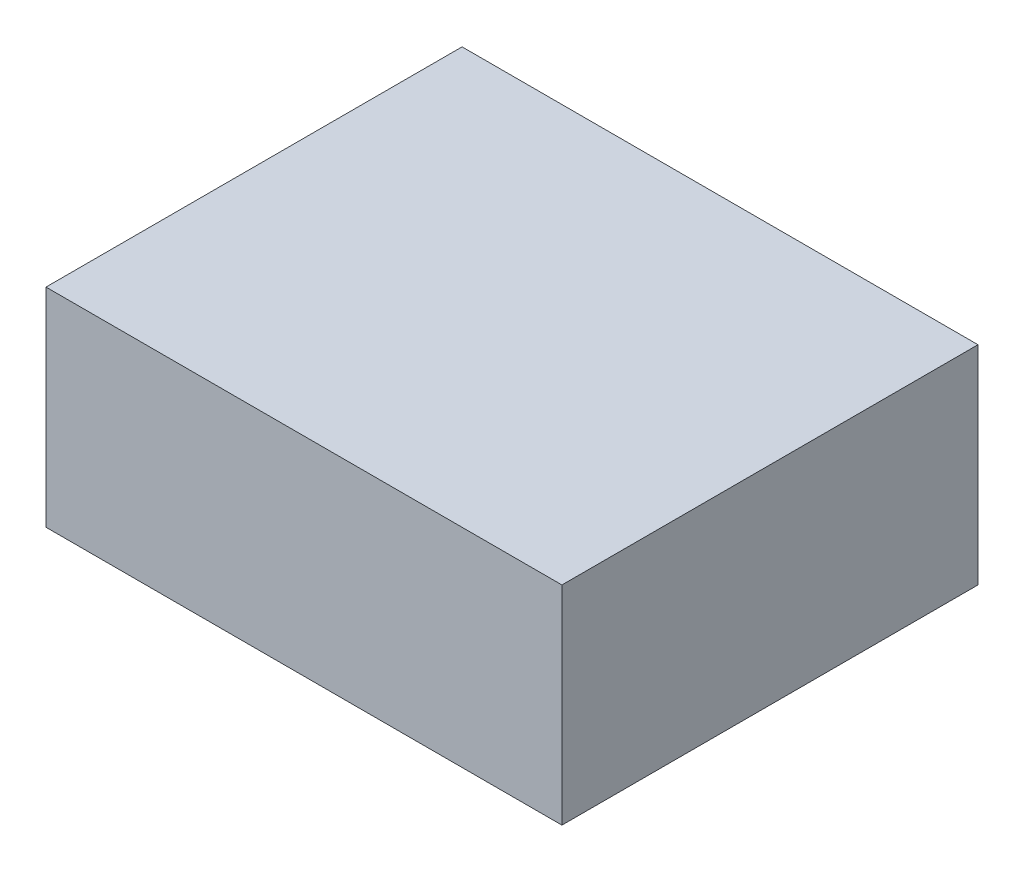
ISO-10303-21;
HEADER;
FILE_DESCRIPTION(('STEP AP214'),'2;1');
FILE_NAME('part.step','',(''),(''),'','','');
FILE_SCHEMA(('AUTOMOTIVE_DESIGN { 1 0 10303 214 1 1 1 1 }'));
ENDSEC;
DATA;
#1=APPLICATION_CONTEXT('core data for automotive mechanical design processes');
#2=APPLICATION_PROTOCOL_DEFINITION('international standard','automotive_design',2000,#1);
#3=PRODUCT_CONTEXT('',#1,'mechanical');
#4=PRODUCT('Part','Part','',(#3));
#5=PRODUCT_RELATED_PRODUCT_CATEGORY('part','',(#4));
#6=PRODUCT_DEFINITION_FORMATION('','',#4);
#7=PRODUCT_DEFINITION_CONTEXT('part definition',#1,'design');
#8=PRODUCT_DEFINITION('design','',#6,#7);
#9=PRODUCT_DEFINITION_SHAPE('','',#8);
#10=(LENGTH_UNIT() NAMED_UNIT(*) SI_UNIT(.MILLI.,.METRE.));
#11=(NAMED_UNIT(*) PLANE_ANGLE_UNIT() SI_UNIT($,.RADIAN.));
#12=(NAMED_UNIT(*) SI_UNIT($,.STERADIAN.) SOLID_ANGLE_UNIT());
#13=UNCERTAINTY_MEASURE_WITH_UNIT(LENGTH_MEASURE(1.E-05),#10,'distance_accuracy_value','');
#14=(GEOMETRIC_REPRESENTATION_CONTEXT(3) GLOBAL_UNCERTAINTY_ASSIGNED_CONTEXT((#13)) GLOBAL_UNIT_ASSIGNED_CONTEXT((#10,
#11,#12)) REPRESENTATION_CONTEXT('',''));
#15=CARTESIAN_POINT('',(0.,0.,0.));
#16=DIRECTION('',(0.,0.,1.));
#17=DIRECTION('',(1.,0.,0.));
#18=AXIS2_PLACEMENT_3D('',#15,#16,#17);
#19=CARTESIAN_POINT('',(6.2,2.5,10.));
#20=DIRECTION('',(-1.,0.,0.));
#21=DIRECTION('',(0.,0.,1.));
#22=AXIS2_PLACEMENT_3D('',#19,#20,#21);
#23=PLANE('',#22);
#24=DIRECTION('',(0.,1.,0.));
#25=VECTOR('',#24,1.);
#26=CARTESIAN_POINT('',(6.2,2.5,0.));
#27=LINE('',#26,#25);
#28=CARTESIAN_POINT('',(6.2,-2.5,0.));
#29=VERTEX_POINT('',#28);
#30=CARTESIAN_POINT('',(6.2,2.5,0.));
#31=VERTEX_POINT('',#30);
#32=EDGE_CURVE('E104',#29,#31,#27,.T.);
#33=ORIENTED_EDGE('',*,*,#32,.T.);
#34=DIRECTION('',(0.,0.,-1.));
#35=VECTOR('',#34,1.);
#36=CARTESIAN_POINT('',(6.2,2.5,10.));
#37=LINE('',#36,#35);
#38=CARTESIAN_POINT('',(6.2,2.5,10.));
#39=VERTEX_POINT('',#38);
#40=EDGE_CURVE('E11',#39,#31,#37,.T.);
#41=ORIENTED_EDGE('',*,*,#40,.F.);
#42=DIRECTION('',(0.,1.,0.));
#43=VECTOR('',#42,1.);
#44=CARTESIAN_POINT('',(6.2,2.5,10.));
#45=LINE('',#44,#43);
#46=CARTESIAN_POINT('',(6.2,-2.5,10.));
#47=VERTEX_POINT('',#46);
#48=EDGE_CURVE('E92',#47,#39,#45,.T.);
#49=ORIENTED_EDGE('',*,*,#48,.F.);
#50=DIRECTION('',(0.,0.,-1.));
#51=VECTOR('',#50,1.);
#52=CARTESIAN_POINT('',(6.2,-2.5,10.));
#53=LINE('',#52,#51);
#54=EDGE_CURVE('E100',#47,#29,#53,.T.);
#55=ORIENTED_EDGE('',*,*,#54,.T.);
#56=EDGE_LOOP('',(#33,#41,#49,#55));
#57=FACE_BOUND('',#56,.T.);
#58=ADVANCED_FACE('F41',(#57),#23,.F.);
#59=CARTESIAN_POINT('',(-6.2,2.5,10.));
#60=DIRECTION('',(0.,-1.,0.));
#61=DIRECTION('',(0.,0.,-1.));
#62=AXIS2_PLACEMENT_3D('',#59,#60,#61);
#63=PLANE('',#62);
#64=DIRECTION('',(-1.,0.,0.));
#65=VECTOR('',#64,1.);
#66=CARTESIAN_POINT('',(-6.2,2.5,0.));
#67=LINE('',#66,#65);
#68=CARTESIAN_POINT('',(-6.2,2.5,0.));
#69=VERTEX_POINT('',#68);
#70=EDGE_CURVE('E96',#31,#69,#67,.T.);
#71=ORIENTED_EDGE('',*,*,#70,.T.);
#72=DIRECTION('',(0.,0.,-1.));
#73=VECTOR('',#72,1.);
#74=CARTESIAN_POINT('',(-6.2,2.5,10.));
#75=LINE('',#74,#73);
#76=CARTESIAN_POINT('',(-6.2,2.5,10.));
#77=VERTEX_POINT('',#76);
#78=EDGE_CURVE('E49',#77,#69,#75,.T.);
#79=ORIENTED_EDGE('',*,*,#78,.F.);
#80=DIRECTION('',(-1.,0.,0.));
#81=VECTOR('',#80,1.);
#82=CARTESIAN_POINT('',(-6.2,2.5,10.));
#83=LINE('',#82,#81);
#84=EDGE_CURVE('E87',#39,#77,#83,.T.);
#85=ORIENTED_EDGE('',*,*,#84,.F.);
#86=ORIENTED_EDGE('',*,*,#40,.T.);
#87=EDGE_LOOP('',(#71,#79,#85,#86));
#88=FACE_BOUND('',#87,.T.);
#89=ADVANCED_FACE('F95',(#88),#63,.F.);
#90=CARTESIAN_POINT('',(-6.2,2.5,10.));
#91=DIRECTION('',(1.,0.,0.));
#92=DIRECTION('',(0.,0.,-1.));
#93=AXIS2_PLACEMENT_3D('',#90,#91,#92);
#94=PLANE('',#93);
#95=DIRECTION('',(0.,-1.,0.));
#96=VECTOR('',#95,1.);
#97=CARTESIAN_POINT('',(-6.2,2.5,0.));
#98=LINE('',#97,#96);
#99=CARTESIAN_POINT('',(-6.2,-2.5,0.));
#100=VERTEX_POINT('',#99);
#101=EDGE_CURVE('E74',#69,#100,#98,.T.);
#102=ORIENTED_EDGE('',*,*,#101,.T.);
#103=DIRECTION('',(0.,0.,-1.));
#104=VECTOR('',#103,1.);
#105=CARTESIAN_POINT('',(-6.2,-2.5,10.));
#106=LINE('',#105,#104);
#107=CARTESIAN_POINT('',(-6.2,-2.5,10.));
#108=VERTEX_POINT('',#107);
#109=EDGE_CURVE('E97',#108,#100,#106,.T.);
#110=ORIENTED_EDGE('',*,*,#109,.F.);
#111=DIRECTION('',(0.,-1.,0.));
#112=VECTOR('',#111,1.);
#113=CARTESIAN_POINT('',(-6.2,2.5,10.));
#114=LINE('',#113,#112);
#115=EDGE_CURVE('E90',#77,#108,#114,.T.);
#116=ORIENTED_EDGE('',*,*,#115,.F.);
#117=ORIENTED_EDGE('',*,*,#78,.T.);
#118=EDGE_LOOP('',(#102,#110,#116,#117));
#119=FACE_BOUND('',#118,.T.);
#120=ADVANCED_FACE('F98',(#119),#94,.F.);
#121=CARTESIAN_POINT('',(-6.2,-2.5,10.));
#122=DIRECTION('',(0.,1.,0.));
#123=DIRECTION('',(0.,0.,1.));
#124=AXIS2_PLACEMENT_3D('',#121,#122,#123);
#125=PLANE('',#124);
#126=DIRECTION('',(1.,0.,0.));
#127=VECTOR('',#126,1.);
#128=CARTESIAN_POINT('',(-6.2,-2.5,0.));
#129=LINE('',#128,#127);
#130=EDGE_CURVE('E80',#100,#29,#129,.T.);
#131=ORIENTED_EDGE('',*,*,#130,.T.);
#132=ORIENTED_EDGE('',*,*,#54,.F.);
#133=DIRECTION('',(1.,0.,0.));
#134=VECTOR('',#133,1.);
#135=CARTESIAN_POINT('',(-6.2,-2.5,10.));
#136=LINE('',#135,#134);
#137=EDGE_CURVE('E57',#108,#47,#136,.T.);
#138=ORIENTED_EDGE('',*,*,#137,.F.);
#139=ORIENTED_EDGE('',*,*,#109,.T.);
#140=EDGE_LOOP('',(#131,#132,#138,#139));
#141=FACE_BOUND('',#140,.T.);
#142=ADVANCED_FACE('F111',(#141),#125,.F.);
#143=CARTESIAN_POINT('',(0.,0.,10.));
#144=DIRECTION('',(0.,0.,1.));
#145=DIRECTION('',(1.,0.,0.));
#146=AXIS2_PLACEMENT_3D('',#143,#144,#145);
#147=PLANE('',#146);
#148=ORIENTED_EDGE('',*,*,#48,.T.);
#149=ORIENTED_EDGE('',*,*,#84,.T.);
#150=ORIENTED_EDGE('',*,*,#115,.T.);
#151=ORIENTED_EDGE('',*,*,#137,.T.);
#152=EDGE_LOOP('',(#148,#149,#150,#151));
#153=FACE_BOUND('',#152,.T.);
#154=ADVANCED_FACE('F88',(#153),#147,.T.);
#155=CARTESIAN_POINT('',(0.,0.,0.));
#156=DIRECTION('',(0.,0.,1.));
#157=DIRECTION('',(1.,0.,0.));
#158=AXIS2_PLACEMENT_3D('',#155,#156,#157);
#159=PLANE('',#158);
#160=ORIENTED_EDGE('',*,*,#32,.F.);
#161=ORIENTED_EDGE('',*,*,#130,.F.);
#162=ORIENTED_EDGE('',*,*,#101,.F.);
#163=ORIENTED_EDGE('',*,*,#70,.F.);
#164=EDGE_LOOP('',(#160,#161,#162,#163));
#165=FACE_BOUND('',#164,.T.);
#166=ADVANCED_FACE('F114',(#165),#159,.F.);
#167=CLOSED_SHELL('',(#58,#89,#120,#142,#154,#166));
#168=MANIFOLD_SOLID_BREP('B2',#167);
#169=ADVANCED_BREP_SHAPE_REPRESENTATION('',(#18,#168),#14);
#170=SHAPE_DEFINITION_REPRESENTATION(#9,#169);
ENDSEC;
END-ISO-10303-21;
